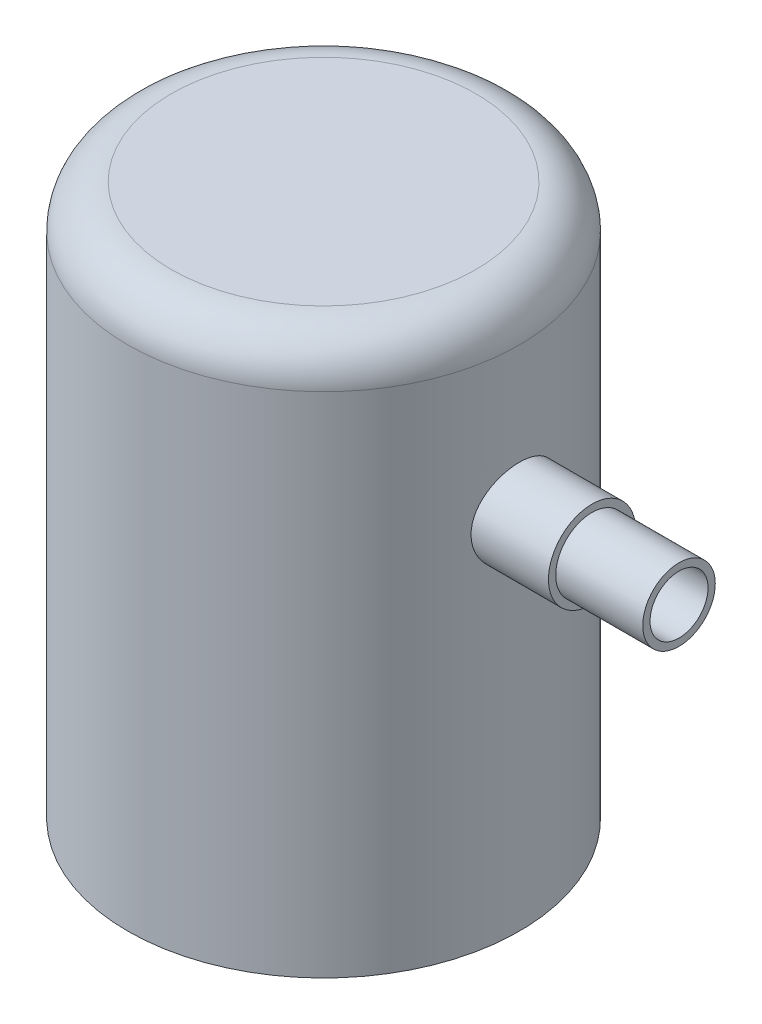
ISO-10303-21;
HEADER;
FILE_DESCRIPTION(('STEP AP214'),'2;1');
FILE_NAME('part.step','',(''),(''),'','','');
FILE_SCHEMA(('AUTOMOTIVE_DESIGN { 1 0 10303 214 1 1 1 1 }'));
ENDSEC;
DATA;
#1=APPLICATION_CONTEXT('core data for automotive mechanical design processes');
#2=APPLICATION_PROTOCOL_DEFINITION('international standard','automotive_design',2000,#1);
#3=PRODUCT_CONTEXT('',#1,'mechanical');
#4=PRODUCT('Part','Part','',(#3));
#5=PRODUCT_RELATED_PRODUCT_CATEGORY('part','',(#4));
#6=PRODUCT_DEFINITION_FORMATION('','',#4);
#7=PRODUCT_DEFINITION_CONTEXT('part definition',#1,'design');
#8=PRODUCT_DEFINITION('design','',#6,#7);
#9=PRODUCT_DEFINITION_SHAPE('','',#8);
#10=(LENGTH_UNIT() NAMED_UNIT(*) SI_UNIT(.MILLI.,.METRE.));
#11=(NAMED_UNIT(*) PLANE_ANGLE_UNIT() SI_UNIT($,.RADIAN.));
#12=(NAMED_UNIT(*) SI_UNIT($,.STERADIAN.) SOLID_ANGLE_UNIT());
#13=UNCERTAINTY_MEASURE_WITH_UNIT(LENGTH_MEASURE(1.E-05),#10,'distance_accuracy_value','');
#14=(GEOMETRIC_REPRESENTATION_CONTEXT(3) GLOBAL_UNCERTAINTY_ASSIGNED_CONTEXT((#13)) GLOBAL_UNIT_ASSIGNED_CONTEXT((#10,
#11,#12)) REPRESENTATION_CONTEXT('',''));
#15=CARTESIAN_POINT('',(0.,0.,0.));
#16=DIRECTION('',(0.,0.,1.));
#17=DIRECTION('',(1.,0.,0.));
#18=AXIS2_PLACEMENT_3D('',#15,#16,#17);
#19=CARTESIAN_POINT('',(24.5,25.,0.));
#20=DIRECTION('',(1.,0.,0.));
#21=DIRECTION('',(0.,0.,-1.));
#22=AXIS2_PLACEMENT_3D('',#19,#20,#21);
#23=PLANE('',#22);
#24=CARTESIAN_POINT('',(24.5,25.,0.));
#25=DIRECTION('',(1.,0.,0.));
#26=DIRECTION('',(0.,0.,-1.));
#27=AXIS2_PLACEMENT_3D('',#24,#25,#26);
#28=CIRCLE('',#27,2.);
#29=CARTESIAN_POINT('',(24.5,25.,-2.));
#30=VERTEX_POINT('',#29);
#31=EDGE_CURVE('E80',#30,#30,#28,.T.);
#32=ORIENTED_EDGE('',*,*,#31,.F.);
#33=EDGE_LOOP('',(#32));
#34=FACE_BOUND('',#33,.T.);
#35=CARTESIAN_POINT('',(24.5,25.,0.));
#36=DIRECTION('',(1.,0.,0.));
#37=DIRECTION('',(0.,0.,-1.));
#38=AXIS2_PLACEMENT_3D('',#35,#36,#37);
#39=CIRCLE('',#38,2.5);
#40=CARTESIAN_POINT('',(24.5,25.,-2.5));
#41=VERTEX_POINT('',#40);
#42=EDGE_CURVE('E147',#41,#41,#39,.T.);
#43=ORIENTED_EDGE('',*,*,#42,.T.);
#44=EDGE_LOOP('',(#43));
#45=FACE_BOUND('',#44,.T.);
#46=ADVANCED_FACE('F44',(#34,#45),#23,.T.);
#47=CARTESIAN_POINT('',(-13.502,25.,0.));
#48=DIRECTION('',(1.,0.,0.));
#49=DIRECTION('',(0.,0.,-1.));
#50=AXIS2_PLACEMENT_3D('',#47,#48,#49);
#51=CYLINDRICAL_SURFACE('',#50,3.);
#52=CARTESIAN_POINT('',(13.1624465810882,25.,-3.));
#53=CARTESIAN_POINT('',(13.162449939686,25.166263551574,-2.99999437421922));
#54=CARTESIAN_POINT('',(13.1656311803976,25.3325941189877,-2.98613119718498));
#55=CARTESIAN_POINT('',(13.1779880857712,25.6605202391333,-2.93110835499428));
#56=CARTESIAN_POINT('',(13.1871679940659,25.822112355124,-2.88992936552138));
#57=CARTESIAN_POINT('',(13.2104323856515,26.1357706334045,-2.78163957468419));
#58=CARTESIAN_POINT('',(13.2245113863689,26.2878472210006,-2.71455775200915));
#59=CARTESIAN_POINT('',(13.2559809946233,26.5785925105857,-2.55645005152967));
#60=CARTESIAN_POINT('',(13.2733715564475,26.7172613976144,-2.46542450423718));
#61=CARTESIAN_POINT('',(13.3098435492506,26.9796738570526,-2.26032161188685));
#62=CARTESIAN_POINT('',(13.3289471973885,27.1031496431796,-2.1459055466883));
#63=CARTESIAN_POINT('',(13.3664985517074,27.3293241286586,-1.89800051829547));
#64=CARTESIAN_POINT('',(13.3849462057791,27.4320211804655,-1.76451004412277));
#65=CARTESIAN_POINT('',(13.4193493920259,27.614786127093,-1.48044591785635));
#66=CARTESIAN_POINT('',(13.4352756511115,27.6945958741797,-1.32970232479962));
#67=CARTESIAN_POINT('',(13.4625903650323,27.8276497025807,-1.01652950347792));
#68=CARTESIAN_POINT('',(13.4739793457426,27.8808968627065,-0.854101632010432));
#69=CARTESIAN_POINT('',(13.4907792670088,27.9584701494083,-0.524956194492505));
#70=CARTESIAN_POINT('',(13.496283823904,27.9832496638006,-0.358350342392885));
#71=CARTESIAN_POINT('',(13.5010192342806,28.0046024063086,-0.023261486679037));
#72=CARTESIAN_POINT('',(13.5002508276442,28.0011789609007,0.145221293214815));
#73=CARTESIAN_POINT('',(13.4925982402692,27.966559416256,0.476153881401518));
#74=CARTESIAN_POINT('',(13.4858216940701,27.9358520813634,0.638657676490726));
#75=CARTESIAN_POINT('',(13.4670371595346,27.8483159986673,0.956146268315122));
#76=CARTESIAN_POINT('',(13.4550289297203,27.7914860451201,1.11113071761421));
#77=CARTESIAN_POINT('',(13.4269580790848,27.6528895388486,1.4105306540864));
#78=CARTESIAN_POINT('',(13.4108656882919,27.5709389251833,1.55485803134103));
#79=CARTESIAN_POINT('',(13.3763890752603,27.3845648590765,1.82788970481721));
#80=CARTESIAN_POINT('',(13.3580045315994,27.2801382533951,1.9565918049443));
#81=CARTESIAN_POINT('',(13.3204974859024,27.0491197092206,2.19762748437124));
#82=CARTESIAN_POINT('',(13.3013676144021,26.9221000360437,2.30955032771432));
#83=CARTESIAN_POINT('',(13.2648948216275,26.6508958785744,2.51058454530819));
#84=CARTESIAN_POINT('',(13.2475519520106,26.5067108983386,2.5996952602322));
#85=CARTESIAN_POINT('',(13.2165965034763,26.204590167477,2.75276648873958));
#86=CARTESIAN_POINT('',(13.2029958072444,26.046612665793,2.81664716161095));
#87=CARTESIAN_POINT('',(13.1812277113555,25.7217907430766,2.91682904284752));
#88=CARTESIAN_POINT('',(13.1730594190277,25.554947783714,2.95313478255712));
#89=CARTESIAN_POINT('',(13.1632636274194,25.2208900194104,2.99649448350305));
#90=CARTESIAN_POINT('',(13.1615022037629,25.0537568034402,3.00414748151695));
#91=CARTESIAN_POINT('',(13.1643579678824,24.7206026155562,2.9916082113652));
#92=CARTESIAN_POINT('',(13.1689747021814,24.5545815654123,2.97141792281369));
#93=CARTESIAN_POINT('',(13.1839399241269,24.2304646937551,2.90428555984044));
#94=CARTESIAN_POINT('',(13.1942172550355,24.0722965370556,2.85767538981651));
#95=CARTESIAN_POINT('',(13.2192811275877,23.766015053307,2.73938662708086));
#96=CARTESIAN_POINT('',(13.2340681121974,23.6179027157508,2.66770557165019));
#97=CARTESIAN_POINT('',(13.2667781107747,23.3333505973354,2.49999705249822));
#98=CARTESIAN_POINT('',(13.2847471146597,23.1971330275224,2.40360171706266));
#99=CARTESIAN_POINT('',(13.3216761301978,22.942587463887,2.18968056440659));
#100=CARTESIAN_POINT('',(13.3406362688621,22.8242617704571,2.0721520342964));
#101=CARTESIAN_POINT('',(13.3778540089087,22.6065229847371,1.81658582192193));
#102=CARTESIAN_POINT('',(13.3960909909727,22.5075189461958,1.67819611475441));
#103=CARTESIAN_POINT('',(13.4294236716516,22.334163798649,1.38640224321388));
#104=CARTESIAN_POINT('',(13.4445195194113,22.2598115190498,1.23299879221959));
#105=CARTESIAN_POINT('',(13.4697823307937,22.1384348280499,0.916502850004943));
#106=CARTESIAN_POINT('',(13.4799810032788,22.0912342061588,0.753480582261611));
#107=CARTESIAN_POINT('',(13.4944376504927,22.0249522599752,0.421567630193387));
#108=CARTESIAN_POINT('',(13.4986965181926,22.0058667089292,0.252677831887782));
#109=CARTESIAN_POINT('',(13.5007661280042,21.9965518264466,-0.0822972683105569));
#110=CARTESIAN_POINT('',(13.4987131684573,22.0057125540111,-0.248365058604295));
#111=CARTESIAN_POINT('',(13.4886828969468,22.0512624258351,-0.576531062049225));
#112=CARTESIAN_POINT('',(13.480705698223,22.0876510496425,-0.738629351014933));
#113=CARTESIAN_POINT('',(13.4597345559667,22.1863275357921,-1.05376542717996));
#114=CARTESIAN_POINT('',(13.4467578748893,22.2485263358511,-1.20683232396081));
#115=CARTESIAN_POINT('',(13.4171713097671,22.3969717053092,-1.50043729213955));
#116=CARTESIAN_POINT('',(13.4005610609598,22.4832206892703,-1.64097410368605));
#117=CARTESIAN_POINT('',(13.365112239233,22.6792934161946,-1.90849634926497));
#118=CARTESIAN_POINT('',(13.3462364922944,22.7895445535342,-2.03516363758941));
#119=CARTESIAN_POINT('',(13.3085806076653,23.0296332046785,-2.26840759852962));
#120=CARTESIAN_POINT('',(13.2898004942272,23.1594754536851,-2.37497939998719));
#121=CARTESIAN_POINT('',(13.2541705524972,23.4372317496819,-2.56643776712976));
#122=CARTESIAN_POINT('',(13.2373511866028,23.585371925111,-2.65100228786962));
#123=CARTESIAN_POINT('',(13.2079326027974,23.8941053430567,-2.79390039487));
#124=CARTESIAN_POINT('',(13.195329866909,24.0546880661585,-2.85225586159949));
#125=CARTESIAN_POINT('',(13.1780643261061,24.3461597110829,-2.93084024198602));
#126=CARTESIAN_POINT('',(13.1722470677159,24.4754851409102,-2.95672473071977));
#127=CARTESIAN_POINT('',(13.1644369637272,24.7365264348703,-2.99130639255913));
#128=CARTESIAN_POINT('',(13.1624439195214,24.8682421745057,-3.00000445822692));
#129=CARTESIAN_POINT('',(13.1624465810882,25.,-3.));
#130=B_SPLINE_CURVE_WITH_KNOTS('',3,(#52,#53,#54,#55,#56,#57,#58,#59,#60,#61,#62,#63,#64,#65,
#66,#67,#68,#69,#70,#71,#72,#73,#74,#75,#76,#77,#78,#79,#80,#81,#82,#83,#84,#85,#86,#87,#88,#89,
#90,#91,#92,#93,#94,#95,#96,#97,#98,#99,#100,#101,#102,#103,#104,#105,#106,#107,#108,#109,#110,
#111,#112,#113,#114,#115,#116,#117,#118,#119,#120,#121,#122,#123,#124,#125,#126,#127,#128,#129),
.UNSPECIFIED.,.T.,.F.,(4,2,2,2,2,2,2,2,2,2,2,2,2,2,2,2,2,2,2,2,2,2,2,2,2,2,2,2,2,2,2,2,2,2,2,2,
2,2,4),(0.,0.498307675530976,0.996968250668841,1.49507256011671,1.99316999424372,
2.49906890879464,3.00500792034452,3.51644718964213,4.027827165349,4.53094457218484,
5.03400263829122,5.52822662761368,6.02247343116045,6.52043187009742,7.0184602150513,
7.52718070946972,8.03591590550602,8.54624834175488,9.05649689774055,9.5560162427495,
10.0555000745451,10.5488438692604,11.0422361388693,11.5434484309065,12.0447251100686,
12.555675690653,13.0666020051728,13.5741739418345,14.081669563536,14.5782838134789,
15.0748885710504,15.56979377669,16.0647486871406,16.5693670418218,17.0741075594952,
17.5858645730318,18.0971935515557,18.4921047944898,18.8869955275069),.UNSPECIFIED.);
#131=CARTESIAN_POINT('',(13.1624465810882,25.,-3.));
#132=VERTEX_POINT('',#131);
#133=EDGE_CURVE('E137',#132,#132,#130,.T.);
#134=ORIENTED_EDGE('',*,*,#133,.T.);
#135=EDGE_LOOP('',(#134));
#136=FACE_BOUND('',#135,.T.);
#137=CARTESIAN_POINT('',(18.5,25.,0.));
#138=DIRECTION('',(1.,0.,0.));
#139=DIRECTION('',(0.,0.,-1.));
#140=AXIS2_PLACEMENT_3D('',#137,#138,#139);
#141=CIRCLE('',#140,3.);
#142=CARTESIAN_POINT('',(18.5,25.,-3.));
#143=VERTEX_POINT('',#142);
#144=EDGE_CURVE('E143',#143,#143,#141,.T.);
#145=ORIENTED_EDGE('',*,*,#144,.F.);
#146=EDGE_LOOP('',(#145));
#147=FACE_BOUND('',#146,.T.);
#148=ADVANCED_FACE('F93',(#136,#147),#51,.T.);
#149=CARTESIAN_POINT('',(0.,38.,0.));
#150=DIRECTION('',(0.,-1.,0.));
#151=DIRECTION('',(0.,0.,-1.));
#152=AXIS2_PLACEMENT_3D('',#149,#150,#151);
#153=CYLINDRICAL_SURFACE('',#152,13.5);
#154=ORIENTED_EDGE('',*,*,#133,.F.);
#155=EDGE_LOOP('',(#154));
#156=FACE_BOUND('',#155,.T.);
#157=CARTESIAN_POINT('',(0.,35.,0.));
#158=DIRECTION('',(0.,1.,0.));
#159=DIRECTION('',(0.,0.,1.));
#160=AXIS2_PLACEMENT_3D('',#157,#158,#159);
#161=CIRCLE('',#160,13.5);
#162=CARTESIAN_POINT('',(0.,35.,13.5));
#163=VERTEX_POINT('',#162);
#164=EDGE_CURVE('E13',#163,#163,#161,.F.);
#165=ORIENTED_EDGE('',*,*,#164,.T.);
#166=EDGE_LOOP('',(#165));
#167=FACE_BOUND('',#166,.T.);
#168=CARTESIAN_POINT('',(0.,0.,0.));
#169=DIRECTION('',(0.,1.,0.));
#170=DIRECTION('',(0.,0.,1.));
#171=AXIS2_PLACEMENT_3D('',#168,#169,#170);
#172=CIRCLE('',#171,13.5);
#173=CARTESIAN_POINT('',(0.,0.,13.5));
#174=VERTEX_POINT('',#173);
#175=EDGE_CURVE('E300',#174,#174,#172,.T.);
#176=ORIENTED_EDGE('',*,*,#175,.T.);
#177=EDGE_LOOP('',(#176));
#178=FACE_BOUND('',#177,.T.);
#179=ADVANCED_FACE('F129',(#156,#167,#178),#153,.T.);
#180=CARTESIAN_POINT('',(0.,38.,0.));
#181=DIRECTION('',(0.,1.,0.));
#182=DIRECTION('',(0.,0.,1.));
#183=AXIS2_PLACEMENT_3D('',#180,#181,#182);
#184=PLANE('',#183);
#185=CARTESIAN_POINT('',(0.,38.,0.));
#186=DIRECTION('',(0.,1.,0.));
#187=DIRECTION('',(0.,0.,1.));
#188=AXIS2_PLACEMENT_3D('',#185,#186,#187);
#189=CIRCLE('',#188,10.5);
#190=CARTESIAN_POINT('',(0.,38.,10.5));
#191=VERTEX_POINT('',#190);
#192=EDGE_CURVE('E57',#191,#191,#189,.T.);
#193=ORIENTED_EDGE('',*,*,#192,.T.);
#194=EDGE_LOOP('',(#193));
#195=FACE_BOUND('',#194,.T.);
#196=ADVANCED_FACE('F247',(#195),#184,.T.);
#197=CARTESIAN_POINT('',(0.,0.,0.));
#198=DIRECTION('',(0.,1.,0.));
#199=DIRECTION('',(0.,0.,1.));
#200=AXIS2_PLACEMENT_3D('',#197,#198,#199);
#201=PLANE('',#200);
#202=CARTESIAN_POINT('',(0.,0.,-10.));
#203=DIRECTION('',(0.,-1.,0.));
#204=DIRECTION('',(0.,0.,-1.));
#205=AXIS2_PLACEMENT_3D('',#202,#203,#204);
#206=CIRCLE('',#205,1.5);
#207=CARTESIAN_POINT('',(0.,0.,-11.5));
#208=VERTEX_POINT('',#207);
#209=EDGE_CURVE('E288',#208,#208,#206,.T.);
#210=ORIENTED_EDGE('',*,*,#209,.F.);
#211=EDGE_LOOP('',(#210));
#212=FACE_BOUND('',#211,.T.);
#213=CARTESIAN_POINT('',(7.,0.,0.));
#214=DIRECTION('',(0.,-1.,0.));
#215=DIRECTION('',(0.,0.,-1.));
#216=AXIS2_PLACEMENT_3D('',#213,#214,#215);
#217=CIRCLE('',#216,3.5);
#218=CARTESIAN_POINT('',(7.,0.,-3.5));
#219=VERTEX_POINT('',#218);
#220=EDGE_CURVE('E281',#219,#219,#217,.T.);
#221=ORIENTED_EDGE('',*,*,#220,.F.);
#222=EDGE_LOOP('',(#221));
#223=FACE_BOUND('',#222,.T.);
#224=CARTESIAN_POINT('',(0.,0.,10.));
#225=DIRECTION('',(0.,-1.,0.));
#226=DIRECTION('',(0.,0.,-1.));
#227=AXIS2_PLACEMENT_3D('',#224,#225,#226);
#228=CIRCLE('',#227,1.5);
#229=CARTESIAN_POINT('',(0.,0.,8.5));
#230=VERTEX_POINT('',#229);
#231=EDGE_CURVE('E292',#230,#230,#228,.T.);
#232=ORIENTED_EDGE('',*,*,#231,.F.);
#233=EDGE_LOOP('',(#232));
#234=FACE_BOUND('',#233,.T.);
#235=CARTESIAN_POINT('',(-6.,0.,0.));
#236=DIRECTION('',(0.,-1.,0.));
#237=DIRECTION('',(0.,0.,-1.));
#238=AXIS2_PLACEMENT_3D('',#235,#236,#237);
#239=CIRCLE('',#238,6.);
#240=CARTESIAN_POINT('',(-6.,0.,-6.));
#241=VERTEX_POINT('',#240);
#242=EDGE_CURVE('E295',#241,#241,#239,.T.);
#243=ORIENTED_EDGE('',*,*,#242,.F.);
#244=EDGE_LOOP('',(#243));
#245=FACE_BOUND('',#244,.T.);
#246=ORIENTED_EDGE('',*,*,#175,.F.);
#247=EDGE_LOOP('',(#246));
#248=FACE_BOUND('',#247,.T.);
#249=ADVANCED_FACE('F306',(#212,#223,#234,#245,#248),#201,.F.);
#250=CARTESIAN_POINT('',(0.,35.,0.));
#251=DIRECTION('',(0.,1.,0.));
#252=DIRECTION('',(0.,0.,1.));
#253=AXIS2_PLACEMENT_3D('',#250,#251,#252);
#254=TOROIDAL_SURFACE('',#253,10.5,3.);
#255=ORIENTED_EDGE('',*,*,#164,.F.);
#256=EDGE_LOOP('',(#255));
#257=FACE_BOUND('',#256,.T.);
#258=ORIENTED_EDGE('',*,*,#192,.F.);
#259=EDGE_LOOP('',(#258));
#260=FACE_BOUND('',#259,.T.);
#261=ADVANCED_FACE('F46',(#257,#260),#254,.T.);
#262=CARTESIAN_POINT('',(-6.,1.,0.));
#263=DIRECTION('',(0.,-1.,0.));
#264=DIRECTION('',(0.,0.,-1.));
#265=AXIS2_PLACEMENT_3D('',#262,#263,#264);
#266=CYLINDRICAL_SURFACE('',#265,6.);
#267=ORIENTED_EDGE('',*,*,#242,.T.);
#268=EDGE_LOOP('',(#267));
#269=FACE_BOUND('',#268,.T.);
#270=CARTESIAN_POINT('',(-6.,27.,0.));
#271=DIRECTION('',(0.,-1.,0.));
#272=DIRECTION('',(0.,0.,-1.));
#273=AXIS2_PLACEMENT_3D('',#270,#271,#272);
#274=CIRCLE('',#273,6.);
#275=CARTESIAN_POINT('',(0.,27.,0.));
#276=VERTEX_POINT('',#275);
#277=EDGE_CURVE('E286',#276,#276,#274,.T.);
#278=ORIENTED_EDGE('',*,*,#277,.F.);
#279=CARTESIAN_POINT('',(0.,27.,0.));
#280=CARTESIAN_POINT('',(3.06018882863849E-07,27.0000005074633,0.109126725773447));
#281=CARTESIAN_POINT('',(-0.00300460984910239,26.9910394677456,0.218250389077099));
#282=CARTESIAN_POINT('',(-0.0146957959343836,26.9555417823656,0.433283521745943));
#283=CARTESIAN_POINT('',(-0.0233826559569486,26.9290033121021,0.539192656237634));
#284=CARTESIAN_POINT('',(-0.0454938418711469,26.8593615132319,0.74466557900355));
#285=CARTESIAN_POINT('',(-0.0589102453829316,26.8162858750815,0.844239651772066));
#286=CARTESIAN_POINT('',(-0.089111085653162,26.7149176543233,1.03474987361065));
#287=CARTESIAN_POINT('',(-0.105896186644439,26.6566220699948,1.12568431391741));
#288=CARTESIAN_POINT('',(-0.141718111139897,26.5243483902825,1.29948335004453));
#289=CARTESIAN_POINT('',(-0.160808870724301,26.449937531479,1.38200740059661));
#290=CARTESIAN_POINT('',(-0.198793704337569,26.2884656905869,1.53366538540416));
#291=CARTESIAN_POINT('',(-0.217687734189015,26.201401930143,1.60279637097892));
#292=CARTESIAN_POINT('',(-0.253733350454521,26.0140297696071,1.72764988445571));
#293=CARTESIAN_POINT('',(-0.270819214486233,25.9134125205358,1.78292971644206));
#294=CARTESIAN_POINT('',(-0.300493891627973,25.7036478110829,1.87563774775544));
#295=CARTESIAN_POINT('',(-0.313084076785084,25.5945029656745,1.91307139477352));
#296=CARTESIAN_POINT('',(-0.331773934612451,25.3746535570066,1.96774692301832));
#297=CARTESIAN_POINT('',(-0.338078084607771,25.2641255830219,1.98562689654353));
#298=CARTESIAN_POINT('',(-0.344086867409846,25.0414724916882,2.00268224666895));
#299=CARTESIAN_POINT('',(-0.343793539545397,24.9293478785816,2.00186340320943));
#300=CARTESIAN_POINT('',(-0.336819699836392,24.712126739112,1.98203980740683));
#301=CARTESIAN_POINT('',(-0.330431682649337,24.606943194162,1.96386782633398));
#302=CARTESIAN_POINT('',(-0.312466845508978,24.4012131607863,1.91121232569883));
#303=CARTESIAN_POINT('',(-0.300889404317844,24.3006672291299,1.87672685318373));
#304=CARTESIAN_POINT('',(-0.273641777375021,24.105174500817,1.79187811612041));
#305=CARTESIAN_POINT('',(-0.257908684137651,24.010343949061,1.74126809741452));
#306=CARTESIAN_POINT('',(-0.224148828485469,23.8302581834406,1.62577821260627));
#307=CARTESIAN_POINT('',(-0.206121404190725,23.7450057461332,1.56089422472801));
#308=CARTESIAN_POINT('',(-0.168653416645179,23.5818168036785,1.41469866536447));
#309=CARTESIAN_POINT('',(-0.14918821290314,23.5044946109819,1.33270630015262));
#310=CARTESIAN_POINT('',(-0.111861232259264,23.3645374666732,1.15667913994012));
#311=CARTESIAN_POINT('',(-0.0939996092386499,23.301903923671,1.06264319132162));
#312=CARTESIAN_POINT('',(-0.0616578412441253,23.1926073995299,0.86389522609253));
#313=CARTESIAN_POINT('',(-0.0472129998392131,23.1461090173185,0.759086552832669));
#314=CARTESIAN_POINT('',(-0.0235886571113018,23.0715936520886,0.542538166729012));
#315=CARTESIAN_POINT('',(-0.0144073269024138,23.0435702491531,0.430800876309905));
#316=CARTESIAN_POINT('',(-0.00264745857119065,23.0078886679553,0.208767659058607));
#317=CARTESIAN_POINT('',(0.00020003667456262,22.9994003816545,0.098619199729692));
#318=CARTESIAN_POINT('',(-0.000221946103450495,23.0006653471969,-0.121550139920474));
#319=CARTESIAN_POINT('',(-0.00349039161275264,23.0104155199598,-0.2315710386393));
#320=CARTESIAN_POINT('',(-0.0155995056579128,23.0472238154719,-0.445039732608509));
#321=CARTESIAN_POINT('',(-0.0242760257761517,23.073772412099,-0.548585613669685));
#322=CARTESIAN_POINT('',(-0.0461630633985987,23.1427868889335,-0.749711917159144));
#323=CARTESIAN_POINT('',(-0.059374159066497,23.1852547989356,-0.847291577017209));
#324=CARTESIAN_POINT('',(-0.0894213742542022,23.2861408636816,-1.03657659278654));
#325=CARTESIAN_POINT('',(-0.106343704884275,23.3449491865663,-1.12805991843429));
#326=CARTESIAN_POINT('',(-0.141894921674748,23.476388300027,-1.30012966027117));
#327=CARTESIAN_POINT('',(-0.160524328123446,23.5490233120635,-1.38071273559115));
#328=CARTESIAN_POINT('',(-0.198463040391103,23.7099575020132,-1.53250501561259));
#329=CARTESIAN_POINT('',(-0.217764778251438,23.7988184538537,-1.60312193849153));
#330=CARTESIAN_POINT('',(-0.254000534105822,23.9875431356218,-1.72851504464714));
#331=CARTESIAN_POINT('',(-0.270934532359949,24.0874069572682,-1.78329109586202));
#332=CARTESIAN_POINT('',(-0.300352164172325,24.2953460305798,-1.87519386083271));
#333=CARTESIAN_POINT('',(-0.31284478414042,24.4034041583375,-1.91235626433003));
#334=CARTESIAN_POINT('',(-0.331783353871004,24.6247573000883,-1.9677893335187));
#335=CARTESIAN_POINT('',(-0.338232027527207,24.7380499308087,-1.98606850990787));
#336=CARTESIAN_POINT('',(-0.34404282251645,24.9603941920818,-2.00255256495468));
#337=CARTESIAN_POINT('',(-0.343751994851692,25.0693646805736,-2.00174051461679));
#338=CARTESIAN_POINT('',(-0.336974603522647,25.2855301498441,-1.98248458689738));
#339=CARTESIAN_POINT('',(-0.330488408612762,25.3927252359102,-1.96404175891716));
#340=CARTESIAN_POINT('',(-0.312309513902162,25.6002713260049,-1.91074362625868));
#341=CARTESIAN_POINT('',(-0.300718039550444,25.700713650009,-1.87620669203102));
#342=CARTESIAN_POINT('',(-0.273672023630625,25.8944548138765,-1.79195873151948));
#343=CARTESIAN_POINT('',(-0.258216624732133,25.987752062376,-1.7422443371076));
#344=CARTESIAN_POINT('',(-0.224343415479071,26.1689673398458,-1.62652138516685));
#345=CARTESIAN_POINT('',(-0.205825767157255,26.2564730037968,-1.55989648552915));
#346=CARTESIAN_POINT('',(-0.168332874334939,26.4193796267684,-1.41328576627129));
#347=CARTESIAN_POINT('',(-0.149357501752551,26.4947771513761,-1.33329616890296));
#348=CARTESIAN_POINT('',(-0.112199389489114,26.6342888245784,-1.15848311384137));
#349=CARTESIAN_POINT('',(-0.0940763639748647,26.697848695502,-1.06320302699945));
#350=CARTESIAN_POINT('',(-0.0614801765477572,26.8079808577013,-0.862714714813243));
#351=CARTESIAN_POINT('',(-0.0470060818414021,26.8545574918441,-0.757509036264691));
#352=CARTESIAN_POINT('',(-0.0238896986291617,26.9274432649773,-0.544987294401947));
#353=CARTESIAN_POINT('',(-0.0150157515495445,26.9545649325267,-0.437975515352813));
#354=CARTESIAN_POINT('',(-0.00307185871556186,26.9908405613542,-0.220640832020491));
#355=CARTESIAN_POINT('',(-3.09361899790967E-07,26.9999994869931,-0.110318851137491));
#356=CARTESIAN_POINT('',(0.,27.,0.));
#357=B_SPLINE_CURVE_WITH_KNOTS('',3,(#279,#280,#281,#282,#283,#284,#285,#286,#287,#288,#289,
#290,#291,#292,#293,#294,#295,#296,#297,#298,#299,#300,#301,#302,#303,#304,#305,#306,#307,#308,
#309,#310,#311,#312,#313,#314,#315,#316,#317,#318,#319,#320,#321,#322,#323,#324,#325,#326,#327,
#328,#329,#330,#331,#332,#333,#334,#335,#336,#337,#338,#339,#340,#341,#342,#343,#344,#345,#346,
#347,#348,#349,#350,#351,#352,#353,#354,#355,#356),.UNSPECIFIED.,.T.,.F.,(4,2,2,2,2,2,2,2,2,2,2,
2,2,2,2,2,2,2,2,2,2,2,2,2,2,2,2,2,2,2,2,2,2,2,2,2,2,2,4),(0.,0.32697421205202,0.653982370535039,
0.980445345740545,1.3069727555982,1.64369368565511,1.9804886657506,2.3269676964694,
2.67334089385665,3.00803851483679,3.34263267974969,3.66193653102559,3.98127861710962,
4.30576342310259,4.63034205116413,4.97186611622732,5.31342291933235,5.65836811300713,
6.00319337754414,6.33307166350337,6.6628942632835,6.98316315956424,7.30347290568205,
7.6322079968747,7.96104361643779,8.304820457615,8.64860016469989,8.99168027653537,
9.33460569411677,9.65991332128513,9.98520158702746,10.3043117416083,10.6234927635195,
10.9566013338361,11.2898042224755,11.635993216702,11.9820936230491,12.3127311674762,
12.6432773207627),.UNSPECIFIED.);
#358=EDGE_CURVE('E62',#276,#276,#357,.T.);
#359=ORIENTED_EDGE('',*,*,#358,.T.);
#360=EDGE_LOOP('',(#278,#359));
#361=FACE_BOUND('',#360,.T.);
#362=ADVANCED_FACE('F82',(#269,#361),#266,.F.);
#363=CARTESIAN_POINT('',(0.,1.,10.));
#364=DIRECTION('',(0.,-1.,0.));
#365=DIRECTION('',(0.,0.,-1.));
#366=AXIS2_PLACEMENT_3D('',#363,#364,#365);
#367=CYLINDRICAL_SURFACE('',#366,1.5);
#368=ORIENTED_EDGE('',*,*,#231,.T.);
#369=EDGE_LOOP('',(#368));
#370=FACE_BOUND('',#369,.T.);
#371=CARTESIAN_POINT('',(0.,3.,10.));
#372=DIRECTION('',(0.,-1.,0.));
#373=DIRECTION('',(0.,0.,-1.));
#374=AXIS2_PLACEMENT_3D('',#371,#372,#373);
#375=CIRCLE('',#374,1.5);
#376=CARTESIAN_POINT('',(0.,3.,8.5));
#377=VERTEX_POINT('',#376);
#378=EDGE_CURVE('E70',#377,#377,#375,.T.);
#379=ORIENTED_EDGE('',*,*,#378,.F.);
#380=EDGE_LOOP('',(#379));
#381=FACE_BOUND('',#380,.T.);
#382=ADVANCED_FACE('F110',(#370,#381),#367,.F.);
#383=CARTESIAN_POINT('',(7.,1.,0.));
#384=DIRECTION('',(0.,-1.,0.));
#385=DIRECTION('',(0.,0.,-1.));
#386=AXIS2_PLACEMENT_3D('',#383,#384,#385);
#387=CYLINDRICAL_SURFACE('',#386,3.5);
#388=CARTESIAN_POINT('',(4.12771867673098,25.,-1.99999999999999));
#389=CARTESIAN_POINT('',(4.127715452879,24.8982407169768,-1.99999795577563));
#390=CARTESIAN_POINT('',(4.12222932376888,24.796466728318,-1.99218519270228));
#391=CARTESIAN_POINT('',(4.10119953311168,24.5962654046356,-1.96144931078718));
#392=CARTESIAN_POINT('',(4.0856451481588,24.4978417557443,-1.93851008069799));
#393=CARTESIAN_POINT('',(4.04690923763257,24.3076214992802,-1.87896057653213));
#394=CARTESIAN_POINT('',(4.02377732788451,24.2157863969553,-1.8424390311734));
#395=CARTESIAN_POINT('',(3.97257940832733,24.0395840008187,-1.75704253677618));
#396=CARTESIAN_POINT('',(3.94451181779178,23.9552191125101,-1.70816362790349));
#397=CARTESIAN_POINT('',(3.88287071175276,23.7861806587717,-1.59317521338082));
#398=CARTESIAN_POINT('',(3.84903101624886,23.7024899346934,-1.52576320711109));
#399=CARTESIAN_POINT('',(3.78179365518074,23.5468020921183,-1.37830388138078));
#400=CARTESIAN_POINT('',(3.74839629028064,23.4748125866884,-1.29824840204569));
#401=CARTESIAN_POINT('',(3.68203760356562,23.3378329150705,-1.11854160271472));
#402=CARTESIAN_POINT('',(3.64941819248883,23.2741545717601,-1.01775177832642));
#403=CARTESIAN_POINT('',(3.59197457101114,23.1651191300037,-0.804671960588801));
#404=CARTESIAN_POINT('',(3.56714392069526,23.119746886747,-0.692391570313769));
#405=CARTESIAN_POINT('',(3.53003663627695,23.0528618996064,-0.470016279358686));
#406=CARTESIAN_POINT('',(3.51684417406938,23.0295943583629,-0.360605805974546));
#407=CARTESIAN_POINT('',(3.50098710273159,23.0016929960495,-0.138713712116237));
#408=CARTESIAN_POINT('',(3.49831375931743,22.9970437157211,-0.0262347176938101));
#409=CARTESIAN_POINT('',(3.50347489759117,23.00608689984,0.184946963787598));
#410=CARTESIAN_POINT('',(3.51015821734037,23.0177697564384,0.283772577167379));
#411=CARTESIAN_POINT('',(3.5313908943351,23.0553945244468,0.477779282721361));
#412=CARTESIAN_POINT('',(3.54594083026425,23.0813374848602,0.572960106226072));
#413=CARTESIAN_POINT('',(3.58179091864806,23.1466509922967,0.758178496759091));
#414=CARTESIAN_POINT('',(3.60314987412982,23.1861387474121,0.84816287736819));
#415=CARTESIAN_POINT('',(3.65084731234565,23.27711784117,1.02037827753867));
#416=CARTESIAN_POINT('',(3.6771872629297,23.3286127192377,1.10260700085174));
#417=CARTESIAN_POINT('',(3.73605444725418,23.4487459212786,1.26692918495856));
#418=CARTESIAN_POINT('',(3.76894451940778,23.5186641582258,1.34795656029944));
#419=CARTESIAN_POINT('',(3.83560962859448,23.6703346593411,1.49778980682765));
#420=CARTESIAN_POINT('',(3.86938569637921,23.7521012576527,1.56658064643715));
#421=CARTESIAN_POINT('',(3.93787756848886,23.9348802228836,1.69686219905414));
#422=CARTESIAN_POINT('',(3.97235168918566,24.0369984415641,1.75694261459508));
#423=CARTESIAN_POINT('',(4.03371298050522,24.2520775259131,1.85868169503533));
#424=CARTESIAN_POINT('',(4.06061356324387,24.3650187432372,1.90037300071842));
#425=CARTESIAN_POINT('',(4.09734637049101,24.5719095906267,1.95587400145499));
#426=CARTESIAN_POINT('',(4.10967571323004,24.6642913421735,1.97388069289565));
#427=CARTESIAN_POINT('',(4.12538141865303,24.8513881708449,1.99669026146641));
#428=CARTESIAN_POINT('',(4.12876636504116,24.9461009227801,2.00150579796717));
#429=CARTESIAN_POINT('',(4.12609622280877,25.1351634321212,1.99766863089417));
#430=CARTESIAN_POINT('',(4.1200355522991,25.2295129418331,1.98900796355996));
#431=CARTESIAN_POINT('',(4.09934253019827,25.4151495964577,1.95870152807443));
#432=CARTESIAN_POINT('',(4.08470393399092,25.5064344591086,1.93704629977863));
#433=CARTESIAN_POINT('',(4.04849088201002,25.6849532816667,1.88140846842957));
#434=CARTESIAN_POINT('',(4.02683186251701,25.7721221947249,1.84727488278456));
#435=CARTESIAN_POINT('',(3.97893580469777,25.9398419588285,1.76785702986689));
#436=CARTESIAN_POINT('',(3.95269690012318,26.0203900922281,1.72256821386609));
#437=CARTESIAN_POINT('',(3.89333600238073,26.1867473184664,1.61341400894956));
#438=CARTESIAN_POINT('',(3.85979491925331,26.27120471487,1.54771199604099));
#439=CARTESIAN_POINT('',(3.79281125517308,26.4286857212583,1.40365915117367));
#440=CARTESIAN_POINT('',(3.75936877922519,26.5016997723841,1.32529785443658));
#441=CARTESIAN_POINT('',(3.69238437688455,26.6414787390566,1.14867494696646));
#442=CARTESIAN_POINT('',(3.65916608892655,26.7068912634178,1.04920745926283));
#443=CARTESIAN_POINT('',(3.60016978459363,26.8196584472334,0.838502048903093));
#444=CARTESIAN_POINT('',(3.57438589206462,26.8670273779258,0.727273517759566));
#445=CARTESIAN_POINT('',(3.53505000884867,26.9382164247035,0.505697568225662));
#446=CARTESIAN_POINT('',(3.52067284727933,26.9636402141799,0.396016146177101));
#447=CARTESIAN_POINT('',(3.50250159282287,26.9956646331974,0.173110532524916));
#448=CARTESIAN_POINT('',(3.49869814433836,27.0022819028205,0.0598895624756663));
#449=CARTESIAN_POINT('',(3.50190492634049,26.9966629930359,-0.152663446388152));
#450=CARTESIAN_POINT('',(3.50770801770525,26.9865316276306,-0.252078181064035));
#451=CARTESIAN_POINT('',(3.52733919074634,26.9518141403517,-0.447516424373191));
#452=CARTESIAN_POINT('',(3.54116769313428,26.927227260684,-0.543539754940817));
#453=CARTESIAN_POINT('',(3.57564643243152,26.8646387409123,-0.729940626918294));
#454=CARTESIAN_POINT('',(3.59630786444032,26.8266150788745,-0.820308611690867));
#455=CARTESIAN_POINT('',(3.64276713177731,26.7385086083168,-0.993497634912796));
#456=CARTESIAN_POINT('',(3.66856637250437,26.6884224994424,-1.07631659934355));
#457=CARTESIAN_POINT('',(3.72641147836363,26.5713852762283,-1.24182171167628));
#458=CARTESIAN_POINT('',(3.75883223626657,26.5031857172137,-1.32349322177373));
#459=CARTESIAN_POINT('',(3.82485650638969,26.3549693048777,-1.4748902230412));
#460=CARTESIAN_POINT('',(3.85846139232404,26.2749383574626,-1.54460124934942));
#461=CARTESIAN_POINT('',(3.92717039853173,26.0953869839831,-1.67746044898755));
#462=CARTESIAN_POINT('',(3.96206359239564,25.9947035551574,-1.73915916121082));
#463=CARTESIAN_POINT('',(4.02480324502152,25.7823081719937,-1.84444649268111));
#464=CARTESIAN_POINT('',(4.05266121348645,25.6706146521001,-1.88806476770662));
#465=CARTESIAN_POINT('',(4.09152236760749,25.4657257609803,-1.9472313620347));
#466=CARTESIAN_POINT('',(4.10492837545211,25.3741836596729,-1.9669281834474));
#467=CARTESIAN_POINT('',(4.12302395512517,25.1884301916641,-1.99330737566683));
#468=CARTESIAN_POINT('',(4.12772166177408,25.0942213996669,-2.00000189279714));
#469=CARTESIAN_POINT('',(4.12771867673098,25.,-1.99999999999999));
#470=B_SPLINE_CURVE_WITH_KNOTS('',3,(#388,#389,#390,#391,#392,#393,#394,#395,#396,#397,#398,
#399,#400,#401,#402,#403,#404,#405,#406,#407,#408,#409,#410,#411,#412,#413,#414,#415,#416,#417,
#418,#419,#420,#421,#422,#423,#424,#425,#426,#427,#428,#429,#430,#431,#432,#433,#434,#435,#436,
#437,#438,#439,#440,#441,#442,#443,#444,#445,#446,#447,#448,#449,#450,#451,#452,#453,#454,#455,
#456,#457,#458,#459,#460,#461,#462,#463,#464,#465,#466,#467,#468,#469),.UNSPECIFIED.,.T.,.F.,(4,
2,2,2,2,2,2,2,2,2,2,2,2,2,2,2,2,2,2,2,2,2,2,2,2,2,2,2,2,2,2,2,2,2,2,2,2,2,2,2,4),(0.,
0.304883874922046,0.610093008270219,0.913342368040706,1.21668902547472,1.55333694497106,
1.89020302568346,2.25902542597165,2.62754206720091,2.96347760859662,3.29913415548683,
3.59693222043895,3.89475219497792,4.19521719766629,4.49577088279063,4.8303003334503,
5.16523793001606,5.533547887342,5.90120143518936,6.18472748221687,6.46798133769667,
6.75140264557762,7.03503053719283,7.32221037238042,7.6095075042814,7.94456853256898,
8.27990796934226,8.64873850633049,9.01727671507225,9.35580044793151,9.69402456028394,
9.99288076018052,10.2917526282629,10.591116615435,10.8905626035456,11.222913671625,
11.5556638903259,11.9232239861484,12.2901787962962,12.572742293729,12.8550417024666),.UNSPECIFIED.);
#471=CARTESIAN_POINT('',(4.12771867673098,25.,-1.99999999999999));
#472=VERTEX_POINT('',#471);
#473=EDGE_CURVE('E48',#472,#472,#470,.T.);
#474=ORIENTED_EDGE('',*,*,#473,.T.);
#475=EDGE_LOOP('',(#474));
#476=FACE_BOUND('',#475,.T.);
#477=CARTESIAN_POINT('',(9.87228132326902,25.,-1.99999999999999));
#478=CARTESIAN_POINT('',(9.872284547121,25.1017592830232,-1.99999795577563));
#479=CARTESIAN_POINT('',(9.87777067623112,25.203533271682,-1.99218519270228));
#480=CARTESIAN_POINT('',(9.89880046688832,25.4037345953644,-1.96144931078718));
#481=CARTESIAN_POINT('',(9.9143548518412,25.5021582442557,-1.93851008069799));
#482=CARTESIAN_POINT('',(9.95309076236743,25.6923785007198,-1.87896057653213));
#483=CARTESIAN_POINT('',(9.97622267211549,25.7842136030447,-1.8424390311734));
#484=CARTESIAN_POINT('',(10.0274205916727,25.9604159991813,-1.75704253677618));
#485=CARTESIAN_POINT('',(10.0554881822082,26.0447808874899,-1.70816362790349));
#486=CARTESIAN_POINT('',(10.1171292882472,26.2138193412283,-1.59317521338082));
#487=CARTESIAN_POINT('',(10.1509689837511,26.2975100653066,-1.5257632071111));
#488=CARTESIAN_POINT('',(10.2182063448193,26.4531979078817,-1.37830388138078));
#489=CARTESIAN_POINT('',(10.2516037097194,26.5251874133116,-1.29824840204569));
#490=CARTESIAN_POINT('',(10.3179623964344,26.6621670849296,-1.11854160271473));
#491=CARTESIAN_POINT('',(10.3505818075112,26.7258454282399,-1.01775177832642));
#492=CARTESIAN_POINT('',(10.4080254289889,26.8348808699963,-0.804671960588803));
#493=CARTESIAN_POINT('',(10.4328560793047,26.880253113253,-0.692391570313771));
#494=CARTESIAN_POINT('',(10.4699633637231,26.9471381003936,-0.470016279358687));
#495=CARTESIAN_POINT('',(10.4831558259306,26.9704056416371,-0.360605805974547));
#496=CARTESIAN_POINT('',(10.4990128972684,26.9983070039505,-0.138713712116237));
#497=CARTESIAN_POINT('',(10.5016862406826,27.0029562842789,-0.02623471769381));
#498=CARTESIAN_POINT('',(10.4965251024088,26.99391310016,0.184946963787598));
#499=CARTESIAN_POINT('',(10.4898417826596,26.9822302435616,0.283772577167379));
#500=CARTESIAN_POINT('',(10.4686091056649,26.9446054755532,0.47777928272136));
#501=CARTESIAN_POINT('',(10.4540591697357,26.9186625151398,0.572960106226072));
#502=CARTESIAN_POINT('',(10.4182090813519,26.8533490077033,0.758178496759091));
#503=CARTESIAN_POINT('',(10.3968501258702,26.8138612525879,0.84816287736819));
#504=CARTESIAN_POINT('',(10.3491526876543,26.72288215883,1.02037827753867));
#505=CARTESIAN_POINT('',(10.3228127370703,26.6713872807623,1.10260700085174));
#506=CARTESIAN_POINT('',(10.2639455527458,26.5512540787214,1.26692918495856));
#507=CARTESIAN_POINT('',(10.2310554805922,26.4813358417742,1.34795656029944));
#508=CARTESIAN_POINT('',(10.1643903714055,26.3296653406589,1.49778980682765));
#509=CARTESIAN_POINT('',(10.1306143036208,26.2478987423473,1.56658064643715));
#510=CARTESIAN_POINT('',(10.0621224315111,26.0651197771164,1.69686219905414));
#511=CARTESIAN_POINT('',(10.0276483108143,25.9630015584359,1.75694261459508));
#512=CARTESIAN_POINT('',(9.96628701949478,25.7479224740869,1.85868169503533));
#513=CARTESIAN_POINT('',(9.93938643675613,25.6349812567628,1.90037300071842));
#514=CARTESIAN_POINT('',(9.90265362950899,25.4280904093733,1.95587400145499));
#515=CARTESIAN_POINT('',(9.89032428676996,25.3357086578265,1.97388069289565));
#516=CARTESIAN_POINT('',(9.87461858134697,25.1486118291551,1.99669026146641));
#517=CARTESIAN_POINT('',(9.87123363495884,25.0538990772199,2.00150579796717));
#518=CARTESIAN_POINT('',(9.87390377719123,24.8648365678788,1.99766863089417));
#519=CARTESIAN_POINT('',(9.8799644477009,24.7704870581669,1.98900796355996));
#520=CARTESIAN_POINT('',(9.90065746980173,24.5848504035423,1.95870152807443));
#521=CARTESIAN_POINT('',(9.91529606600908,24.4935655408914,1.93704629977863));
#522=CARTESIAN_POINT('',(9.95150911798998,24.3150467183333,1.88140846842957));
#523=CARTESIAN_POINT('',(9.97316813748299,24.2278778052751,1.84727488278456));
#524=CARTESIAN_POINT('',(10.0210641953022,24.0601580411715,1.76785702986689));
#525=CARTESIAN_POINT('',(10.0473030998768,23.9796099077719,1.72256821386609));
#526=CARTESIAN_POINT('',(10.1066639976193,23.8132526815336,1.61341400894956));
#527=CARTESIAN_POINT('',(10.1402050807467,23.72879528513,1.54771199604099));
#528=CARTESIAN_POINT('',(10.2071887448269,23.5713142787417,1.40365915117368));
#529=CARTESIAN_POINT('',(10.2406312207748,23.4983002276159,1.32529785443658));
#530=CARTESIAN_POINT('',(10.3076156231155,23.3585212609434,1.14867494696646));
#531=CARTESIAN_POINT('',(10.3408339110734,23.2931087365823,1.04920745926283));
#532=CARTESIAN_POINT('',(10.3998302154064,23.1803415527666,0.838502048903096));
#533=CARTESIAN_POINT('',(10.4256141079354,23.1329726220742,0.72727351775957));
#534=CARTESIAN_POINT('',(10.4649499911513,23.0617835752965,0.505697568225668));
#535=CARTESIAN_POINT('',(10.4793271527207,23.0363597858201,0.396016146177106));
#536=CARTESIAN_POINT('',(10.4974984071771,23.0043353668026,0.173110532524921));
#537=CARTESIAN_POINT('',(10.5013018556616,22.9977180971795,0.0598895624756704));
#538=CARTESIAN_POINT('',(10.4980950736595,23.0033370069641,-0.152663446388148));
#539=CARTESIAN_POINT('',(10.4922919822948,23.0134683723694,-0.25207818106403));
#540=CARTESIAN_POINT('',(10.4726608092537,23.0481858596483,-0.447516424373187));
#541=CARTESIAN_POINT('',(10.4588323068657,23.072772739316,-0.543539754940813));
#542=CARTESIAN_POINT('',(10.4243535675685,23.1353612590877,-0.729940626918291));
#543=CARTESIAN_POINT('',(10.4036921355597,23.1733849211255,-0.820308611690864));
#544=CARTESIAN_POINT('',(10.3572328682227,23.2614913916833,-0.993497634912793));
#545=CARTESIAN_POINT('',(10.3314336274956,23.3115775005576,-1.07631659934354));
#546=CARTESIAN_POINT('',(10.2735885216364,23.4286147237717,-1.24182171167628));
#547=CARTESIAN_POINT('',(10.2411677637334,23.4968142827863,-1.32349322177373));
#548=CARTESIAN_POINT('',(10.1751434936103,23.6450306951223,-1.47489022304119));
#549=CARTESIAN_POINT('',(10.141538607676,23.7250616425374,-1.54460124934942));
#550=CARTESIAN_POINT('',(10.0728296014683,23.9046130160169,-1.67746044898754));
#551=CARTESIAN_POINT('',(10.0379364076044,24.0052964448426,-1.73915916121081));
#552=CARTESIAN_POINT('',(9.97519675497848,24.2176918280063,-1.84444649268111));
#553=CARTESIAN_POINT('',(9.94733878651355,24.3293853478999,-1.88806476770662));
#554=CARTESIAN_POINT('',(9.90847763239251,24.5342742390197,-1.9472313620347));
#555=CARTESIAN_POINT('',(9.89507162454789,24.6258163403271,-1.9669281834474));
#556=CARTESIAN_POINT('',(9.87697604487483,24.8115698083359,-1.99330737566683));
#557=CARTESIAN_POINT('',(9.87227833822593,24.9057786003331,-2.00000189279714));
#558=CARTESIAN_POINT('',(9.87228132326902,25.,-1.99999999999999));
#559=B_SPLINE_CURVE_WITH_KNOTS('',3,(#477,#478,#479,#480,#481,#482,#483,#484,#485,#486,#487,
#488,#489,#490,#491,#492,#493,#494,#495,#496,#497,#498,#499,#500,#501,#502,#503,#504,#505,#506,
#507,#508,#509,#510,#511,#512,#513,#514,#515,#516,#517,#518,#519,#520,#521,#522,#523,#524,#525,
#526,#527,#528,#529,#530,#531,#532,#533,#534,#535,#536,#537,#538,#539,#540,#541,#542,#543,#544,
#545,#546,#547,#548,#549,#550,#551,#552,#553,#554,#555,#556,#557,#558),.UNSPECIFIED.,.T.,.F.,(4,
2,2,2,2,2,2,2,2,2,2,2,2,2,2,2,2,2,2,2,2,2,2,2,2,2,2,2,2,2,2,2,2,2,2,2,2,2,2,2,4),(0.,
0.304883874922046,0.610093008270219,0.913342368040705,1.21668902547472,1.55333694497105,
1.89020302568346,2.25902542597165,2.62754206720091,2.96347760859662,3.29913415548683,
3.59693222043895,3.89475219497792,4.19521719766628,4.49577088279063,4.8303003334503,
5.16523793001606,5.53354788734199,5.90120143518936,6.18472748221686,6.46798133769666,
6.75140264557761,7.03503053719282,7.32221037238041,7.6095075042814,7.94456853256897,
8.27990796934225,8.64873850633048,9.01727671507225,9.35580044793151,9.69402456028394,
9.99288076018051,10.2917526282629,10.591116615435,10.8905626035456,11.222913671625,
11.5556638903259,11.9232239861484,12.2901787962962,12.572742293729,12.8550417024666),.UNSPECIFIED.);
#560=CARTESIAN_POINT('',(9.87228132326902,25.,-1.99999999999999));
#561=VERTEX_POINT('',#560);
#562=EDGE_CURVE('E73',#561,#561,#559,.T.);
#563=ORIENTED_EDGE('',*,*,#562,.T.);
#564=EDGE_LOOP('',(#563));
#565=FACE_BOUND('',#564,.T.);
#566=ORIENTED_EDGE('',*,*,#220,.T.);
#567=EDGE_LOOP('',(#566));
#568=FACE_BOUND('',#567,.T.);
#569=CARTESIAN_POINT('',(7.,32.,0.));
#570=DIRECTION('',(0.,-1.,0.));
#571=DIRECTION('',(0.,0.,-1.));
#572=AXIS2_PLACEMENT_3D('',#569,#570,#571);
#573=CIRCLE('',#572,3.5);
#574=CARTESIAN_POINT('',(7.,32.,-3.5));
#575=VERTEX_POINT('',#574);
#576=EDGE_CURVE('E284',#575,#575,#573,.T.);
#577=ORIENTED_EDGE('',*,*,#576,.F.);
#578=EDGE_LOOP('',(#577));
#579=FACE_BOUND('',#578,.T.);
#580=ADVANCED_FACE('F105',(#476,#565,#568,#579),#387,.F.);
#581=CARTESIAN_POINT('',(0.,1.,-10.));
#582=DIRECTION('',(0.,-1.,0.));
#583=DIRECTION('',(0.,0.,-1.));
#584=AXIS2_PLACEMENT_3D('',#581,#582,#583);
#585=CYLINDRICAL_SURFACE('',#584,1.5);
#586=ORIENTED_EDGE('',*,*,#209,.T.);
#587=EDGE_LOOP('',(#586));
#588=FACE_BOUND('',#587,.T.);
#589=CARTESIAN_POINT('',(0.,3.,-10.));
#590=DIRECTION('',(0.,-1.,0.));
#591=DIRECTION('',(0.,0.,-1.));
#592=AXIS2_PLACEMENT_3D('',#589,#590,#591);
#593=CIRCLE('',#592,1.5);
#594=CARTESIAN_POINT('',(0.,3.,-11.5));
#595=VERTEX_POINT('',#594);
#596=EDGE_CURVE('E67',#595,#595,#593,.T.);
#597=ORIENTED_EDGE('',*,*,#596,.F.);
#598=EDGE_LOOP('',(#597));
#599=FACE_BOUND('',#598,.T.);
#600=ADVANCED_FACE('F109',(#588,#599),#585,.F.);
#601=CARTESIAN_POINT('',(-6.,27.,0.));
#602=DIRECTION('',(0.,-1.,0.));
#603=DIRECTION('',(0.,0.,-1.));
#604=AXIS2_PLACEMENT_3D('',#601,#602,#603);
#605=PLANE('',#604);
#606=ORIENTED_EDGE('',*,*,#277,.T.);
#607=EDGE_LOOP('',(#606));
#608=FACE_BOUND('',#607,.T.);
#609=ADVANCED_FACE('F115',(#608),#605,.T.);
#610=CARTESIAN_POINT('',(7.,32.,0.));
#611=DIRECTION('',(0.,-1.,0.));
#612=DIRECTION('',(0.,0.,-1.));
#613=AXIS2_PLACEMENT_3D('',#610,#611,#612);
#614=PLANE('',#613);
#615=ORIENTED_EDGE('',*,*,#576,.T.);
#616=EDGE_LOOP('',(#615));
#617=FACE_BOUND('',#616,.T.);
#618=ADVANCED_FACE('F120',(#617),#614,.T.);
#619=CARTESIAN_POINT('',(0.,3.,-10.));
#620=DIRECTION('',(0.,-1.,0.));
#621=DIRECTION('',(0.,0.,-1.));
#622=AXIS2_PLACEMENT_3D('',#619,#620,#621);
#623=PLANE('',#622);
#624=ORIENTED_EDGE('',*,*,#596,.T.);
#625=EDGE_LOOP('',(#624));
#626=FACE_BOUND('',#625,.T.);
#627=ADVANCED_FACE('F195',(#626),#623,.T.);
#628=CARTESIAN_POINT('',(0.,3.,10.));
#629=DIRECTION('',(0.,-1.,0.));
#630=DIRECTION('',(0.,0.,-1.));
#631=AXIS2_PLACEMENT_3D('',#628,#629,#630);
#632=PLANE('',#631);
#633=ORIENTED_EDGE('',*,*,#378,.T.);
#634=EDGE_LOOP('',(#633));
#635=FACE_BOUND('',#634,.T.);
#636=ADVANCED_FACE('F96',(#635),#632,.T.);
#637=CARTESIAN_POINT('',(13.5,25.,0.));
#638=DIRECTION('',(1.,0.,0.));
#639=DIRECTION('',(0.,0.,-1.));
#640=AXIS2_PLACEMENT_3D('',#637,#638,#639);
#641=CYLINDRICAL_SURFACE('',#640,1.99999999999999);
#642=ORIENTED_EDGE('',*,*,#562,.F.);
#643=EDGE_LOOP('',(#642));
#644=FACE_BOUND('',#643,.T.);
#645=ORIENTED_EDGE('',*,*,#31,.T.);
#646=EDGE_LOOP('',(#645));
#647=FACE_BOUND('',#646,.T.);
#648=ADVANCED_FACE('F91',(#644,#647),#641,.F.);
#649=ORIENTED_EDGE('',*,*,#473,.F.);
#650=EDGE_LOOP('',(#649));
#651=FACE_BOUND('',#650,.T.);
#652=ORIENTED_EDGE('',*,*,#358,.F.);
#653=EDGE_LOOP('',(#652));
#654=FACE_BOUND('',#653,.T.);
#655=ADVANCED_FACE('F63',(#651,#654),#641,.F.);
#656=CARTESIAN_POINT('',(18.5,25.,0.));
#657=DIRECTION('',(1.,0.,0.));
#658=DIRECTION('',(0.,0.,-1.));
#659=AXIS2_PLACEMENT_3D('',#656,#657,#658);
#660=PLANE('',#659);
#661=CARTESIAN_POINT('',(18.5,25.,0.));
#662=DIRECTION('',(1.,0.,0.));
#663=DIRECTION('',(0.,0.,-1.));
#664=AXIS2_PLACEMENT_3D('',#661,#662,#663);
#665=CIRCLE('',#664,2.5);
#666=CARTESIAN_POINT('',(18.5,25.,-2.5));
#667=VERTEX_POINT('',#666);
#668=EDGE_CURVE('E146',#667,#667,#665,.T.);
#669=ORIENTED_EDGE('',*,*,#668,.F.);
#670=EDGE_LOOP('',(#669));
#671=FACE_BOUND('',#670,.T.);
#672=ORIENTED_EDGE('',*,*,#144,.T.);
#673=EDGE_LOOP('',(#672));
#674=FACE_BOUND('',#673,.T.);
#675=ADVANCED_FACE('F90',(#671,#674),#660,.T.);
#676=CARTESIAN_POINT('',(18.5,25.,0.));
#677=DIRECTION('',(1.,0.,0.));
#678=DIRECTION('',(0.,0.,-1.));
#679=AXIS2_PLACEMENT_3D('',#676,#677,#678);
#680=CYLINDRICAL_SURFACE('',#679,2.5);
#681=ORIENTED_EDGE('',*,*,#668,.T.);
#682=EDGE_LOOP('',(#681));
#683=FACE_BOUND('',#682,.T.);
#684=ORIENTED_EDGE('',*,*,#42,.F.);
#685=EDGE_LOOP('',(#684));
#686=FACE_BOUND('',#685,.T.);
#687=ADVANCED_FACE('F153',(#683,#686),#680,.T.);
#688=CLOSED_SHELL('',(#46,#148,#179,#196,#249,#261,#362,#382,#580,#600,#609,#618,#627,#636,#648,
#655,#675,#687));
#689=MANIFOLD_SOLID_BREP('B2',#688);
#690=ADVANCED_BREP_SHAPE_REPRESENTATION('',(#18,#689),#14);
#691=SHAPE_DEFINITION_REPRESENTATION(#9,#690);
ENDSEC;
END-ISO-10303-21;
